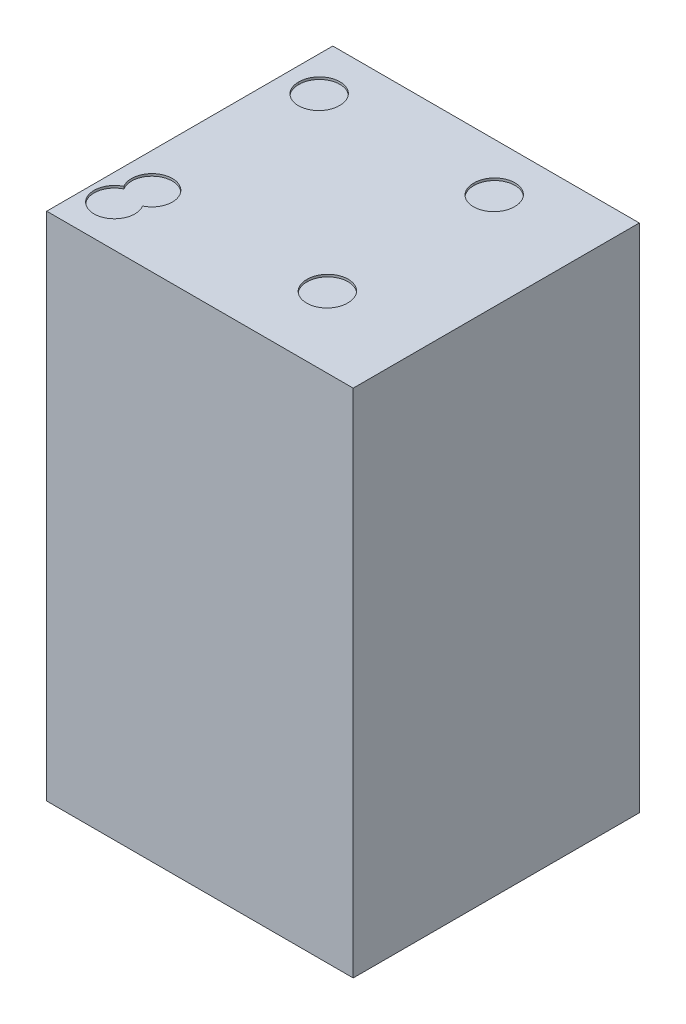
ISO-10303-21;
HEADER;
FILE_DESCRIPTION(('STEP AP214'),'2;1');
FILE_NAME('part.step','',(''),(''),'','','');
FILE_SCHEMA(('AUTOMOTIVE_DESIGN { 1 0 10303 214 1 1 1 1 }'));
ENDSEC;
DATA;
#1=APPLICATION_CONTEXT('core data for automotive mechanical design processes');
#2=APPLICATION_PROTOCOL_DEFINITION('international standard','automotive_design',2000,#1);
#3=PRODUCT_CONTEXT('',#1,'mechanical');
#4=PRODUCT('Part','Part','',(#3));
#5=PRODUCT_RELATED_PRODUCT_CATEGORY('part','',(#4));
#6=PRODUCT_DEFINITION_FORMATION('','',#4);
#7=PRODUCT_DEFINITION_CONTEXT('part definition',#1,'design');
#8=PRODUCT_DEFINITION('design','',#6,#7);
#9=PRODUCT_DEFINITION_SHAPE('','',#8);
#10=(LENGTH_UNIT() NAMED_UNIT(*) SI_UNIT(.MILLI.,.METRE.));
#11=(NAMED_UNIT(*) PLANE_ANGLE_UNIT() SI_UNIT($,.RADIAN.));
#12=(NAMED_UNIT(*) SI_UNIT($,.STERADIAN.) SOLID_ANGLE_UNIT());
#13=UNCERTAINTY_MEASURE_WITH_UNIT(LENGTH_MEASURE(1.E-05),#10,'distance_accuracy_value','');
#14=(GEOMETRIC_REPRESENTATION_CONTEXT(3) GLOBAL_UNCERTAINTY_ASSIGNED_CONTEXT((#13)) GLOBAL_UNIT_ASSIGNED_CONTEXT((#10,
#11,#12)) REPRESENTATION_CONTEXT('',''));
#15=CARTESIAN_POINT('',(0.,0.,0.));
#16=DIRECTION('',(0.,0.,1.));
#17=DIRECTION('',(1.,0.,0.));
#18=AXIS2_PLACEMENT_3D('',#15,#16,#17);
#19=CARTESIAN_POINT('',(22.5,-75.,21.));
#20=DIRECTION('',(1.,0.,0.));
#21=DIRECTION('',(0.,0.,-1.));
#22=AXIS2_PLACEMENT_3D('',#19,#20,#21);
#23=PLANE('',#22);
#24=DIRECTION('',(0.,0.,-1.));
#25=VECTOR('',#24,1.);
#26=CARTESIAN_POINT('',(22.5,0.,21.));
#27=LINE('',#26,#25);
#28=CARTESIAN_POINT('',(22.5,0.,21.));
#29=VERTEX_POINT('',#28);
#30=CARTESIAN_POINT('',(22.5,0.,-21.));
#31=VERTEX_POINT('',#30);
#32=EDGE_CURVE('E172',#29,#31,#27,.T.);
#33=ORIENTED_EDGE('',*,*,#32,.F.);
#34=DIRECTION('',(0.,1.,0.));
#35=VECTOR('',#34,1.);
#36=CARTESIAN_POINT('',(22.5,-75.,21.));
#37=LINE('',#36,#35);
#38=CARTESIAN_POINT('',(22.5,-75.,21.));
#39=VERTEX_POINT('',#38);
#40=EDGE_CURVE('E11',#39,#29,#37,.T.);
#41=ORIENTED_EDGE('',*,*,#40,.F.);
#42=DIRECTION('',(0.,0.,-1.));
#43=VECTOR('',#42,1.);
#44=CARTESIAN_POINT('',(22.5,-75.,21.));
#45=LINE('',#44,#43);
#46=CARTESIAN_POINT('',(22.5,-75.,-21.));
#47=VERTEX_POINT('',#46);
#48=EDGE_CURVE('E158',#39,#47,#45,.T.);
#49=ORIENTED_EDGE('',*,*,#48,.T.);
#50=DIRECTION('',(0.,1.,0.));
#51=VECTOR('',#50,1.);
#52=CARTESIAN_POINT('',(22.5,-75.,-21.));
#53=LINE('',#52,#51);
#54=EDGE_CURVE('E171',#47,#31,#53,.T.);
#55=ORIENTED_EDGE('',*,*,#54,.T.);
#56=EDGE_LOOP('',(#33,#41,#49,#55));
#57=FACE_BOUND('',#56,.T.);
#58=ADVANCED_FACE('F35',(#57),#23,.T.);
#59=CARTESIAN_POINT('',(-22.5,-75.,21.));
#60=DIRECTION('',(0.,0.,1.));
#61=DIRECTION('',(1.,0.,0.));
#62=AXIS2_PLACEMENT_3D('',#59,#60,#61);
#63=PLANE('',#62);
#64=DIRECTION('',(1.,0.,0.));
#65=VECTOR('',#64,1.);
#66=CARTESIAN_POINT('',(-22.5,0.,21.));
#67=LINE('',#66,#65);
#68=CARTESIAN_POINT('',(-22.5,0.,21.));
#69=VERTEX_POINT('',#68);
#70=EDGE_CURVE('E162',#69,#29,#67,.T.);
#71=ORIENTED_EDGE('',*,*,#70,.F.);
#72=DIRECTION('',(0.,1.,0.));
#73=VECTOR('',#72,1.);
#74=CARTESIAN_POINT('',(-22.5,-75.,21.));
#75=LINE('',#74,#73);
#76=CARTESIAN_POINT('',(-22.5,-75.,21.));
#77=VERTEX_POINT('',#76);
#78=EDGE_CURVE('E43',#77,#69,#75,.T.);
#79=ORIENTED_EDGE('',*,*,#78,.F.);
#80=DIRECTION('',(1.,0.,0.));
#81=VECTOR('',#80,1.);
#82=CARTESIAN_POINT('',(-22.5,-75.,21.));
#83=LINE('',#82,#81);
#84=EDGE_CURVE('E168',#77,#39,#83,.T.);
#85=ORIENTED_EDGE('',*,*,#84,.T.);
#86=ORIENTED_EDGE('',*,*,#40,.T.);
#87=EDGE_LOOP('',(#71,#79,#85,#86));
#88=FACE_BOUND('',#87,.T.);
#89=ADVANCED_FACE('F247',(#88),#63,.T.);
#90=CARTESIAN_POINT('',(-22.5,-75.,21.));
#91=DIRECTION('',(-1.,0.,0.));
#92=DIRECTION('',(0.,0.,1.));
#93=AXIS2_PLACEMENT_3D('',#90,#91,#92);
#94=PLANE('',#93);
#95=DIRECTION('',(0.,0.,1.));
#96=VECTOR('',#95,1.);
#97=CARTESIAN_POINT('',(-22.5,0.,21.));
#98=LINE('',#97,#96);
#99=CARTESIAN_POINT('',(-22.5,0.,-21.));
#100=VERTEX_POINT('',#99);
#101=EDGE_CURVE('E178',#100,#69,#98,.T.);
#102=ORIENTED_EDGE('',*,*,#101,.F.);
#103=DIRECTION('',(0.,1.,0.));
#104=VECTOR('',#103,1.);
#105=CARTESIAN_POINT('',(-22.5,-75.,-21.));
#106=LINE('',#105,#104);
#107=CARTESIAN_POINT('',(-22.5,-75.,-21.));
#108=VERTEX_POINT('',#107);
#109=EDGE_CURVE('E184',#108,#100,#106,.T.);
#110=ORIENTED_EDGE('',*,*,#109,.F.);
#111=DIRECTION('',(0.,0.,1.));
#112=VECTOR('',#111,1.);
#113=CARTESIAN_POINT('',(-22.5,-75.,21.));
#114=LINE('',#113,#112);
#115=EDGE_CURVE('E165',#108,#77,#114,.T.);
#116=ORIENTED_EDGE('',*,*,#115,.T.);
#117=ORIENTED_EDGE('',*,*,#78,.T.);
#118=EDGE_LOOP('',(#102,#110,#116,#117));
#119=FACE_BOUND('',#118,.T.);
#120=ADVANCED_FACE('F252',(#119),#94,.T.);
#121=CARTESIAN_POINT('',(-22.5,-75.,-21.));
#122=DIRECTION('',(0.,0.,-1.));
#123=DIRECTION('',(-1.,0.,0.));
#124=AXIS2_PLACEMENT_3D('',#121,#122,#123);
#125=PLANE('',#124);
#126=DIRECTION('',(-1.,0.,0.));
#127=VECTOR('',#126,1.);
#128=CARTESIAN_POINT('',(-22.5,0.,-21.));
#129=LINE('',#128,#127);
#130=EDGE_CURVE('E175',#31,#100,#129,.T.);
#131=ORIENTED_EDGE('',*,*,#130,.F.);
#132=ORIENTED_EDGE('',*,*,#54,.F.);
#133=DIRECTION('',(-1.,0.,0.));
#134=VECTOR('',#133,1.);
#135=CARTESIAN_POINT('',(-22.5,-75.,-21.));
#136=LINE('',#135,#134);
#137=EDGE_CURVE('E161',#47,#108,#136,.T.);
#138=ORIENTED_EDGE('',*,*,#137,.T.);
#139=ORIENTED_EDGE('',*,*,#109,.T.);
#140=EDGE_LOOP('',(#131,#132,#138,#139));
#141=FACE_BOUND('',#140,.T.);
#142=ADVANCED_FACE('F266',(#141),#125,.T.);
#143=CARTESIAN_POINT('',(0.,-75.,0.));
#144=DIRECTION('',(0.,-1.,0.));
#145=DIRECTION('',(0.,0.,-1.));
#146=AXIS2_PLACEMENT_3D('',#143,#144,#145);
#147=PLANE('',#146);
#148=ORIENTED_EDGE('',*,*,#48,.F.);
#149=ORIENTED_EDGE('',*,*,#84,.F.);
#150=ORIENTED_EDGE('',*,*,#115,.F.);
#151=ORIENTED_EDGE('',*,*,#137,.F.);
#152=EDGE_LOOP('',(#148,#149,#150,#151));
#153=FACE_BOUND('',#152,.T.);
#154=ADVANCED_FACE('F263',(#153),#147,.T.);
#155=CARTESIAN_POINT('',(0.,0.,0.));
#156=DIRECTION('',(0.,-1.,0.));
#157=DIRECTION('',(0.,0.,-1.));
#158=AXIS2_PLACEMENT_3D('',#155,#156,#157);
#159=PLANE('',#158);
#160=CARTESIAN_POINT('',(8.27101726370227,0.,-13.8855734282012));
#161=DIRECTION('',(0.,-1.,0.));
#162=DIRECTION('',(0.,0.,-1.));
#163=AXIS2_PLACEMENT_3D('',#160,#161,#162);
#164=CIRCLE('',#163,2.99999999999999);
#165=CARTESIAN_POINT('',(11.2706334016108,0.,-13.9335632729462));
#166=VERTEX_POINT('',#165);
#167=CARTESIAN_POINT('',(5.27140112579363,0.,-13.9335632729393));
#168=VERTEX_POINT('',#167);
#169=EDGE_CURVE('E38',#166,#168,#164,.T.);
#170=ORIENTED_EDGE('',*,*,#169,.T.);
#171=CARTESIAN_POINT('',(8.27101726370216,0.,-13.9815531176841));
#172=DIRECTION('',(0.,-1.,0.));
#173=DIRECTION('',(0.,0.,-1.));
#174=AXIS2_PLACEMENT_3D('',#171,#172,#173);
#175=CIRCLE('',#174,2.99999999999999);
#176=EDGE_CURVE('E51',#168,#166,#175,.T.);
#177=ORIENTED_EDGE('',*,*,#176,.T.);
#178=EDGE_LOOP('',(#170,#177));
#179=FACE_BOUND('',#178,.T.);
#180=CARTESIAN_POINT('',(-17.4319034078813,0.,-13.8855734282012));
#181=DIRECTION('',(0.,-1.,0.));
#182=DIRECTION('',(0.,0.,-1.));
#183=AXIS2_PLACEMENT_3D('',#180,#181,#182);
#184=CIRCLE('',#183,2.99999999999999);
#185=CARTESIAN_POINT('',(-14.4322872699727,0.,-13.9335632729462));
#186=VERTEX_POINT('',#185);
#187=CARTESIAN_POINT('',(-20.4315195457899,0.,-13.9335632729393));
#188=VERTEX_POINT('',#187);
#189=EDGE_CURVE('E149',#186,#188,#184,.T.);
#190=ORIENTED_EDGE('',*,*,#189,.T.);
#191=CARTESIAN_POINT('',(-17.4319034078814,0.,-13.9815531176841));
#192=DIRECTION('',(0.,-1.,0.));
#193=DIRECTION('',(0.,0.,-1.));
#194=AXIS2_PLACEMENT_3D('',#191,#192,#193);
#195=CIRCLE('',#194,2.99999999999999);
#196=EDGE_CURVE('E59',#188,#186,#195,.T.);
#197=ORIENTED_EDGE('',*,*,#196,.T.);
#198=EDGE_LOOP('',(#190,#197));
#199=FACE_BOUND('',#198,.T.);
#200=CARTESIAN_POINT('',(-17.4319034078813,0.,10.6144908987458));
#201=DIRECTION('',(0.,-1.,0.));
#202=DIRECTION('',(0.,0.,-1.));
#203=AXIS2_PLACEMENT_3D('',#200,#201,#202);
#204=CIRCLE('',#203,2.99999999999999);
#205=CARTESIAN_POINT('',(-19.9914978067525,0.,12.1792517473315));
#206=VERTEX_POINT('',#205);
#207=CARTESIAN_POINT('',(-16.1141649476761,0.,13.3095911474371));
#208=VERTEX_POINT('',#207);
#209=EDGE_CURVE('E153',#206,#208,#204,.T.);
#210=ORIENTED_EDGE('',*,*,#209,.T.);
#211=CARTESIAN_POINT('',(-18.6737593465474,0.,14.8743519960228));
#212=DIRECTION('',(0.,-1.,0.));
#213=DIRECTION('',(0.,0.,-1.));
#214=AXIS2_PLACEMENT_3D('',#211,#212,#213);
#215=CIRCLE('',#214,2.99999999999999);
#216=EDGE_CURVE('E212',#208,#206,#215,.T.);
#217=ORIENTED_EDGE('',*,*,#216,.T.);
#218=EDGE_LOOP('',(#210,#217));
#219=FACE_BOUND('',#218,.T.);
#220=CARTESIAN_POINT('',(8.27101726370227,0.,10.6144908987458));
#221=DIRECTION('',(0.,-1.,0.));
#222=DIRECTION('',(0.,0.,-1.));
#223=AXIS2_PLACEMENT_3D('',#220,#221,#222);
#224=CIRCLE('',#223,2.99999999999999);
#225=CARTESIAN_POINT('',(11.2706334016108,0.,10.5665010540008));
#226=VERTEX_POINT('',#225);
#227=CARTESIAN_POINT('',(5.27140112579363,0.,10.5665010540077));
#228=VERTEX_POINT('',#227);
#229=EDGE_CURVE('E157',#226,#228,#224,.T.);
#230=ORIENTED_EDGE('',*,*,#229,.T.);
#231=CARTESIAN_POINT('',(8.27101726370216,0.,10.5185112092629));
#232=DIRECTION('',(0.,-1.,0.));
#233=DIRECTION('',(0.,0.,-1.));
#234=AXIS2_PLACEMENT_3D('',#231,#232,#233);
#235=CIRCLE('',#234,2.99999999999999);
#236=EDGE_CURVE('E143',#228,#226,#235,.T.);
#237=ORIENTED_EDGE('',*,*,#236,.T.);
#238=EDGE_LOOP('',(#230,#237));
#239=FACE_BOUND('',#238,.T.);
#240=ORIENTED_EDGE('',*,*,#32,.T.);
#241=ORIENTED_EDGE('',*,*,#130,.T.);
#242=ORIENTED_EDGE('',*,*,#101,.T.);
#243=ORIENTED_EDGE('',*,*,#70,.T.);
#244=EDGE_LOOP('',(#240,#241,#242,#243));
#245=FACE_BOUND('',#244,.T.);
#246=ADVANCED_FACE('F193',(#179,#199,#219,#239,#245),#159,.F.);
#247=CARTESIAN_POINT('',(8.27101726370227,-0.3336440579155,10.6144908987458));
#248=DIRECTION('',(0.,-1.,0.));
#249=DIRECTION('',(0.,0.,-1.));
#250=AXIS2_PLACEMENT_3D('',#247,#248,#249);
#251=CYLINDRICAL_SURFACE('',#250,2.99999999999999);
#252=ORIENTED_EDGE('',*,*,#229,.F.);
#253=DIRECTION('',(0.,-1.,0.));
#254=VECTOR('',#253,1.);
#255=CARTESIAN_POINT('',(11.2706334016108,0.166355942084522,10.5665010540008));
#256=LINE('',#255,#254);
#257=CARTESIAN_POINT('',(11.2706334016108,-0.333644057915479,10.5665010540009));
#258=VERTEX_POINT('',#257);
#259=EDGE_CURVE('E139',#226,#258,#256,.T.);
#260=ORIENTED_EDGE('',*,*,#259,.T.);
#261=CARTESIAN_POINT('',(8.27101726370227,-0.333644057915501,10.6144908987458));
#262=DIRECTION('',(0.,-1.,0.));
#263=DIRECTION('',(0.,0.,-1.));
#264=AXIS2_PLACEMENT_3D('',#261,#262,#263);
#265=CIRCLE('',#264,2.99999999999999);
#266=CARTESIAN_POINT('',(5.27140112579363,-0.333644057915479,10.5665010540078));
#267=VERTEX_POINT('',#266);
#268=EDGE_CURVE('E154',#258,#267,#265,.T.);
#269=ORIENTED_EDGE('',*,*,#268,.T.);
#270=DIRECTION('',(0.,-1.,0.));
#271=VECTOR('',#270,1.);
#272=CARTESIAN_POINT('',(5.27140112579363,0.166355942084522,10.5665010540077));
#273=LINE('',#272,#271);
#274=EDGE_CURVE('E220',#267,#228,#273,.F.);
#275=ORIENTED_EDGE('',*,*,#274,.T.);
#276=EDGE_LOOP('',(#252,#260,#269,#275));
#277=FACE_BOUND('',#276,.T.);
#278=ADVANCED_FACE('F228',(#277),#251,.F.);
#279=CARTESIAN_POINT('',(11.2710172637023,-0.3336440579155,10.6144908987458));
#280=DIRECTION('',(0.,-1.,0.));
#281=DIRECTION('',(0.,0.,-1.));
#282=AXIS2_PLACEMENT_3D('',#279,#280,#281);
#283=PLANE('',#282);
#284=ORIENTED_EDGE('',*,*,#268,.F.);
#285=CARTESIAN_POINT('',(8.27101726370216,-0.333644057915479,10.5185112092629));
#286=DIRECTION('',(0.,-1.,0.));
#287=DIRECTION('',(0.,0.,-1.));
#288=AXIS2_PLACEMENT_3D('',#285,#286,#287);
#289=CIRCLE('',#288,2.99999999999999);
#290=EDGE_CURVE('E218',#267,#258,#289,.T.);
#291=ORIENTED_EDGE('',*,*,#290,.F.);
#292=EDGE_LOOP('',(#284,#291));
#293=FACE_BOUND('',#292,.T.);
#294=ADVANCED_FACE('F233',(#293),#283,.F.);
#295=CARTESIAN_POINT('',(-17.4319034078813,-0.3336440579155,10.6144908987458));
#296=DIRECTION('',(0.,-1.,0.));
#297=DIRECTION('',(0.,0.,-1.));
#298=AXIS2_PLACEMENT_3D('',#295,#296,#297);
#299=CYLINDRICAL_SURFACE('',#298,2.99999999999999);
#300=ORIENTED_EDGE('',*,*,#209,.F.);
#301=DIRECTION('',(0.,-1.,0.));
#302=VECTOR('',#301,1.);
#303=CARTESIAN_POINT('',(-19.9914978067525,0.166355942084523,12.1792517473315));
#304=LINE('',#303,#302);
#305=CARTESIAN_POINT('',(-19.9914978067525,-0.333644057915478,12.1792517473315));
#306=VERTEX_POINT('',#305);
#307=EDGE_CURVE('E215',#206,#306,#304,.T.);
#308=ORIENTED_EDGE('',*,*,#307,.T.);
#309=CARTESIAN_POINT('',(-17.4319034078813,-0.333644057915501,10.6144908987458));
#310=DIRECTION('',(0.,-1.,0.));
#311=DIRECTION('',(0.,0.,-1.));
#312=AXIS2_PLACEMENT_3D('',#309,#310,#311);
#313=CIRCLE('',#312,2.99999999999999);
#314=CARTESIAN_POINT('',(-16.1141649476761,-0.333644057915478,13.3095911474371));
#315=VERTEX_POINT('',#314);
#316=EDGE_CURVE('E150',#306,#315,#313,.T.);
#317=ORIENTED_EDGE('',*,*,#316,.T.);
#318=DIRECTION('',(0.,-1.,0.));
#319=VECTOR('',#318,1.);
#320=CARTESIAN_POINT('',(-16.1141649476761,0.166355942084523,13.3095911474371));
#321=LINE('',#320,#319);
#322=EDGE_CURVE('E209',#315,#208,#321,.F.);
#323=ORIENTED_EDGE('',*,*,#322,.T.);
#324=EDGE_LOOP('',(#300,#308,#317,#323));
#325=FACE_BOUND('',#324,.T.);
#326=ADVANCED_FACE('F235',(#325),#299,.F.);
#327=CARTESIAN_POINT('',(-14.4319034078813,-0.3336440579155,10.6144908987458));
#328=DIRECTION('',(0.,-1.,0.));
#329=DIRECTION('',(0.,0.,-1.));
#330=AXIS2_PLACEMENT_3D('',#327,#328,#329);
#331=PLANE('',#330);
#332=ORIENTED_EDGE('',*,*,#316,.F.);
#333=CARTESIAN_POINT('',(-18.6737593465474,-0.333644057915478,14.8743519960228));
#334=DIRECTION('',(0.,-1.,0.));
#335=DIRECTION('',(0.,0.,-1.));
#336=AXIS2_PLACEMENT_3D('',#333,#334,#335);
#337=CIRCLE('',#336,2.99999999999999);
#338=EDGE_CURVE('E207',#315,#306,#337,.T.);
#339=ORIENTED_EDGE('',*,*,#338,.F.);
#340=EDGE_LOOP('',(#332,#339));
#341=FACE_BOUND('',#340,.T.);
#342=ADVANCED_FACE('F241',(#341),#331,.F.);
#343=CARTESIAN_POINT('',(-17.4319034078813,-0.3336440579155,-13.8855734282012));
#344=DIRECTION('',(0.,-1.,0.));
#345=DIRECTION('',(0.,0.,-1.));
#346=AXIS2_PLACEMENT_3D('',#343,#344,#345);
#347=CYLINDRICAL_SURFACE('',#346,2.99999999999999);
#348=ORIENTED_EDGE('',*,*,#189,.F.);
#349=DIRECTION('',(0.,-1.,0.));
#350=VECTOR('',#349,1.);
#351=CARTESIAN_POINT('',(-14.4322872699727,0.16635594208452,-13.9335632729462));
#352=LINE('',#351,#350);
#353=CARTESIAN_POINT('',(-14.4322872699727,-0.333644057915481,-13.9335632729461));
#354=VERTEX_POINT('',#353);
#355=EDGE_CURVE('E198',#186,#354,#352,.T.);
#356=ORIENTED_EDGE('',*,*,#355,.T.);
#357=CARTESIAN_POINT('',(-17.4319034078813,-0.333644057915501,-13.8855734282012));
#358=DIRECTION('',(0.,-1.,0.));
#359=DIRECTION('',(0.,0.,-1.));
#360=AXIS2_PLACEMENT_3D('',#357,#358,#359);
#361=CIRCLE('',#360,2.99999999999999);
#362=CARTESIAN_POINT('',(-20.4315195457899,-0.333644057915481,-13.9335632729392));
#363=VERTEX_POINT('',#362);
#364=EDGE_CURVE('E141',#354,#363,#361,.T.);
#365=ORIENTED_EDGE('',*,*,#364,.T.);
#366=DIRECTION('',(0.,-1.,0.));
#367=VECTOR('',#366,1.);
#368=CARTESIAN_POINT('',(-20.4315195457899,0.16635594208452,-13.9335632729393));
#369=LINE('',#368,#367);
#370=EDGE_CURVE('E200',#363,#188,#369,.F.);
#371=ORIENTED_EDGE('',*,*,#370,.T.);
#372=EDGE_LOOP('',(#348,#356,#365,#371));
#373=FACE_BOUND('',#372,.T.);
#374=ADVANCED_FACE('F197',(#373),#347,.F.);
#375=CARTESIAN_POINT('',(-14.4319034078813,-0.3336440579155,-13.8855734282012));
#376=DIRECTION('',(0.,-1.,0.));
#377=DIRECTION('',(0.,0.,-1.));
#378=AXIS2_PLACEMENT_3D('',#375,#376,#377);
#379=PLANE('',#378);
#380=ORIENTED_EDGE('',*,*,#364,.F.);
#381=CARTESIAN_POINT('',(-17.4319034078814,-0.333644057915481,-13.9815531176841));
#382=DIRECTION('',(0.,-1.,0.));
#383=DIRECTION('',(0.,0.,-1.));
#384=AXIS2_PLACEMENT_3D('',#381,#382,#383);
#385=CIRCLE('',#384,2.99999999999999);
#386=EDGE_CURVE('E136',#363,#354,#385,.T.);
#387=ORIENTED_EDGE('',*,*,#386,.F.);
#388=EDGE_LOOP('',(#380,#387));
#389=FACE_BOUND('',#388,.T.);
#390=ADVANCED_FACE('F321',(#389),#379,.F.);
#391=CARTESIAN_POINT('',(8.27101726370227,-0.3336440579155,-13.8855734282012));
#392=DIRECTION('',(0.,-1.,0.));
#393=DIRECTION('',(0.,0.,-1.));
#394=AXIS2_PLACEMENT_3D('',#391,#392,#393);
#395=CYLINDRICAL_SURFACE('',#394,2.99999999999999);
#396=ORIENTED_EDGE('',*,*,#169,.F.);
#397=DIRECTION('',(0.,-1.,0.));
#398=VECTOR('',#397,1.);
#399=CARTESIAN_POINT('',(11.2706334016108,0.166355942084519,-13.9335632729462));
#400=LINE('',#399,#398);
#401=CARTESIAN_POINT('',(11.2706334016108,-0.333644057915482,-13.9335632729461));
#402=VERTEX_POINT('',#401);
#403=EDGE_CURVE('E125',#166,#402,#400,.T.);
#404=ORIENTED_EDGE('',*,*,#403,.T.);
#405=CARTESIAN_POINT('',(8.27101726370227,-0.333644057915501,-13.8855734282012));
#406=DIRECTION('',(0.,-1.,0.));
#407=DIRECTION('',(0.,0.,-1.));
#408=AXIS2_PLACEMENT_3D('',#405,#406,#407);
#409=CIRCLE('',#408,2.99999999999999);
#410=CARTESIAN_POINT('',(5.27140112579363,-0.333644057915482,-13.9335632729392));
#411=VERTEX_POINT('',#410);
#412=EDGE_CURVE('E134',#402,#411,#409,.T.);
#413=ORIENTED_EDGE('',*,*,#412,.T.);
#414=DIRECTION('',(0.,-1.,0.));
#415=VECTOR('',#414,1.);
#416=CARTESIAN_POINT('',(5.27140112579363,0.166355942084519,-13.9335632729393));
#417=LINE('',#416,#415);
#418=EDGE_CURVE('E126',#411,#168,#417,.F.);
#419=ORIENTED_EDGE('',*,*,#418,.T.);
#420=EDGE_LOOP('',(#396,#404,#413,#419));
#421=FACE_BOUND('',#420,.T.);
#422=ADVANCED_FACE('F133',(#421),#395,.F.);
#423=CARTESIAN_POINT('',(11.2710172637023,-0.3336440579155,-13.8855734282012));
#424=DIRECTION('',(0.,-1.,0.));
#425=DIRECTION('',(0.,0.,-1.));
#426=AXIS2_PLACEMENT_3D('',#423,#424,#425);
#427=PLANE('',#426);
#428=ORIENTED_EDGE('',*,*,#412,.F.);
#429=CARTESIAN_POINT('',(8.27101726370216,-0.333644057915482,-13.9815531176841));
#430=DIRECTION('',(0.,-1.,0.));
#431=DIRECTION('',(0.,0.,-1.));
#432=AXIS2_PLACEMENT_3D('',#429,#430,#431);
#433=CIRCLE('',#432,2.99999999999999);
#434=EDGE_CURVE('E122',#411,#402,#433,.T.);
#435=ORIENTED_EDGE('',*,*,#434,.F.);
#436=EDGE_LOOP('',(#428,#435));
#437=FACE_BOUND('',#436,.T.);
#438=ADVANCED_FACE('F138',(#437),#427,.F.);
#439=CARTESIAN_POINT('',(8.27101726370216,-0.333644057915478,10.5185112092629));
#440=DIRECTION('',(0.,-1.,0.));
#441=DIRECTION('',(0.,0.,-1.));
#442=AXIS2_PLACEMENT_3D('',#439,#440,#441);
#443=CYLINDRICAL_SURFACE('',#442,2.99999999999999);
#444=ORIENTED_EDGE('',*,*,#236,.F.);
#445=ORIENTED_EDGE('',*,*,#274,.F.);
#446=ORIENTED_EDGE('',*,*,#290,.T.);
#447=ORIENTED_EDGE('',*,*,#259,.F.);
#448=EDGE_LOOP('',(#444,#445,#446,#447));
#449=FACE_BOUND('',#448,.T.);
#450=ADVANCED_FACE('F231',(#449),#443,.F.);
#451=CARTESIAN_POINT('',(-18.6737593465474,-0.333644057915476,14.8743519960228));
#452=DIRECTION('',(0.,-1.,0.));
#453=DIRECTION('',(0.,0.,-1.));
#454=AXIS2_PLACEMENT_3D('',#451,#452,#453);
#455=CYLINDRICAL_SURFACE('',#454,2.99999999999999);
#456=ORIENTED_EDGE('',*,*,#216,.F.);
#457=ORIENTED_EDGE('',*,*,#322,.F.);
#458=ORIENTED_EDGE('',*,*,#338,.T.);
#459=ORIENTED_EDGE('',*,*,#307,.F.);
#460=EDGE_LOOP('',(#456,#457,#458,#459));
#461=FACE_BOUND('',#460,.T.);
#462=ADVANCED_FACE('F355',(#461),#455,.F.);
#463=CARTESIAN_POINT('',(-17.4319034078814,-0.33364405791548,-13.9815531176841));
#464=DIRECTION('',(0.,-1.,0.));
#465=DIRECTION('',(0.,0.,-1.));
#466=AXIS2_PLACEMENT_3D('',#463,#464,#465);
#467=CYLINDRICAL_SURFACE('',#466,2.99999999999999);
#468=ORIENTED_EDGE('',*,*,#196,.F.);
#469=ORIENTED_EDGE('',*,*,#370,.F.);
#470=ORIENTED_EDGE('',*,*,#386,.T.);
#471=ORIENTED_EDGE('',*,*,#355,.F.);
#472=EDGE_LOOP('',(#468,#469,#470,#471));
#473=FACE_BOUND('',#472,.T.);
#474=ADVANCED_FACE('F364',(#473),#467,.F.);
#475=CARTESIAN_POINT('',(8.27101726370216,-0.333644057915481,-13.9815531176841));
#476=DIRECTION('',(0.,-1.,0.));
#477=DIRECTION('',(0.,0.,-1.));
#478=AXIS2_PLACEMENT_3D('',#475,#476,#477);
#479=CYLINDRICAL_SURFACE('',#478,2.99999999999999);
#480=ORIENTED_EDGE('',*,*,#176,.F.);
#481=ORIENTED_EDGE('',*,*,#418,.F.);
#482=ORIENTED_EDGE('',*,*,#434,.T.);
#483=ORIENTED_EDGE('',*,*,#403,.F.);
#484=EDGE_LOOP('',(#480,#481,#482,#483));
#485=FACE_BOUND('',#484,.T.);
#486=ADVANCED_FACE('F124',(#485),#479,.F.);
#487=CLOSED_SHELL('',(#58,#89,#120,#142,#154,#246,#278,#294,#326,#342,#374,#390,#422,#438,#450,
#462,#474,#486));
#488=MANIFOLD_SOLID_BREP('B2',#487);
#489=ADVANCED_BREP_SHAPE_REPRESENTATION('',(#18,#488),#14);
#490=SHAPE_DEFINITION_REPRESENTATION(#9,#489);
ENDSEC;
END-ISO-10303-21;
